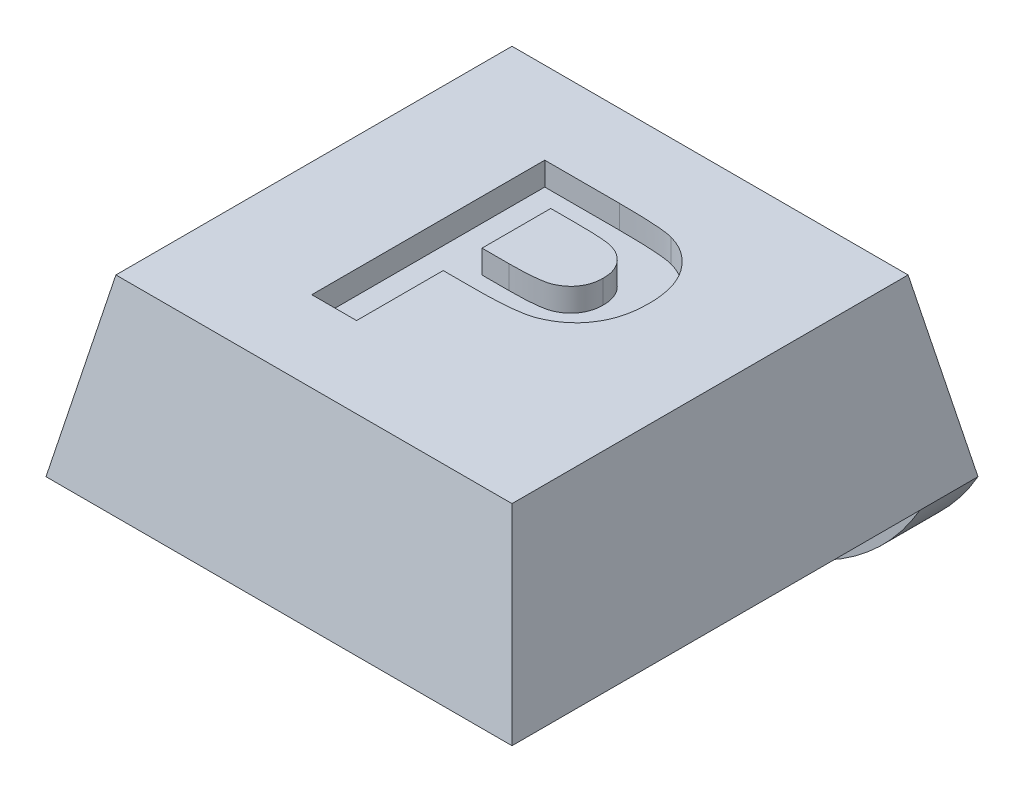
ISO-10303-21;
HEADER;
FILE_DESCRIPTION(('STEP AP214'),'2;1');
FILE_NAME('part.step','',(''),(''),'','','');
FILE_SCHEMA(('AUTOMOTIVE_DESIGN { 1 0 10303 214 1 1 1 1 }'));
ENDSEC;
DATA;
#1=APPLICATION_CONTEXT('core data for automotive mechanical design processes');
#2=APPLICATION_PROTOCOL_DEFINITION('international standard','automotive_design',2000,#1);
#3=PRODUCT_CONTEXT('',#1,'mechanical');
#4=PRODUCT('Part','Part','',(#3));
#5=PRODUCT_RELATED_PRODUCT_CATEGORY('part','',(#4));
#6=PRODUCT_DEFINITION_FORMATION('','',#4);
#7=PRODUCT_DEFINITION_CONTEXT('part definition',#1,'design');
#8=PRODUCT_DEFINITION('design','',#6,#7);
#9=PRODUCT_DEFINITION_SHAPE('','',#8);
#10=(LENGTH_UNIT() NAMED_UNIT(*) SI_UNIT(.MILLI.,.METRE.));
#11=(NAMED_UNIT(*) PLANE_ANGLE_UNIT() SI_UNIT($,.RADIAN.));
#12=(NAMED_UNIT(*) SI_UNIT($,.STERADIAN.) SOLID_ANGLE_UNIT());
#13=UNCERTAINTY_MEASURE_WITH_UNIT(LENGTH_MEASURE(1.E-05),#10,'distance_accuracy_value','');
#14=(GEOMETRIC_REPRESENTATION_CONTEXT(3) GLOBAL_UNCERTAINTY_ASSIGNED_CONTEXT((#13)) GLOBAL_UNIT_ASSIGNED_CONTEXT((#10,
#11,#12)) REPRESENTATION_CONTEXT('',''));
#15=CARTESIAN_POINT('',(0.,0.,0.));
#16=DIRECTION('',(0.,0.,1.));
#17=DIRECTION('',(1.,0.,0.));
#18=AXIS2_PLACEMENT_3D('',#15,#16,#17);
#19=CARTESIAN_POINT('',(0.,3.,0.));
#20=DIRECTION('',(0.,-1.,0.));
#21=DIRECTION('',(0.,0.,-1.));
#22=AXIS2_PLACEMENT_3D('',#19,#20,#21);
#23=PLANE('',#22);
#24=DIRECTION('',(-1.,0.,0.));
#25=VECTOR('',#24,1.);
#26=CARTESIAN_POINT('',(11.,3.,-0.6));
#27=LINE('',#26,#25);
#28=CARTESIAN_POINT('',(7.4,3.,-0.6));
#29=VERTEX_POINT('',#28);
#30=CARTESIAN_POINT('',(0.6,3.,-0.6));
#31=VERTEX_POINT('',#30);
#32=EDGE_CURVE('E409',#29,#31,#27,.T.);
#33=ORIENTED_EDGE('',*,*,#32,.F.);
#34=DIRECTION('',(0.,0.,1.));
#35=VECTOR('',#34,1.);
#36=CARTESIAN_POINT('',(7.4,3.,-8.));
#37=LINE('',#36,#35);
#38=CARTESIAN_POINT('',(7.4,3.,-7.4));
#39=VERTEX_POINT('',#38);
#40=EDGE_CURVE('E422',#39,#29,#37,.T.);
#41=ORIENTED_EDGE('',*,*,#40,.F.);
#42=DIRECTION('',(-1.,0.,0.));
#43=VECTOR('',#42,1.);
#44=CARTESIAN_POINT('',(11.,3.,-7.4));
#45=LINE('',#44,#43);
#46=CARTESIAN_POINT('',(0.599999999999999,3.,-7.4));
#47=VERTEX_POINT('',#46);
#48=EDGE_CURVE('E405',#39,#47,#45,.T.);
#49=ORIENTED_EDGE('',*,*,#48,.T.);
#50=DIRECTION('',(0.,0.,1.));
#51=VECTOR('',#50,1.);
#52=CARTESIAN_POINT('',(0.6,3.,-8.));
#53=LINE('',#52,#51);
#54=EDGE_CURVE('E425',#47,#31,#53,.T.);
#55=ORIENTED_EDGE('',*,*,#54,.T.);
#56=EDGE_LOOP('',(#33,#41,#49,#55));
#57=FACE_BOUND('',#56,.T.);
#58=DIRECTION('',(-1.,0.,0.));
#59=VECTOR('',#58,1.);
#60=CARTESIAN_POINT('',(3.34429936740227,3.,-1.98743460523464));
#61=LINE('',#60,#59);
#62=CARTESIAN_POINT('',(3.34429936740227,3.,-1.98743460523464));
#63=VERTEX_POINT('',#62);
#64=CARTESIAN_POINT('',(2.57506859817151,3.,-1.98743460523464));
#65=VERTEX_POINT('',#64);
#66=EDGE_CURVE('E58',#63,#65,#61,.T.);
#67=ORIENTED_EDGE('',*,*,#66,.T.);
#68=DIRECTION('',(0.,0.,-1.));
#69=VECTOR('',#68,1.);
#70=CARTESIAN_POINT('',(2.57506859817151,3.,-1.98743460523464));
#71=LINE('',#70,#69);
#72=CARTESIAN_POINT('',(2.57506859817151,3.,-5.98743460523464));
#73=VERTEX_POINT('',#72);
#74=EDGE_CURVE('E305',#65,#73,#71,.T.);
#75=ORIENTED_EDGE('',*,*,#74,.T.);
#76=DIRECTION('',(1.,0.,0.));
#77=VECTOR('',#76,1.);
#78=CARTESIAN_POINT('',(2.57506859817151,3.,-5.98743460523464));
#79=LINE('',#78,#77);
#80=CARTESIAN_POINT('',(3.85471603406894,3.,-5.98743460523464));
#81=VERTEX_POINT('',#80);
#82=EDGE_CURVE('E309',#73,#81,#79,.T.);
#83=ORIENTED_EDGE('',*,*,#82,.T.);
#84=CARTESIAN_POINT('',(3.85471603406894,3.,-5.98743460523464));
#85=CARTESIAN_POINT('',(3.91267733034139,3.,-5.9873713087582));
#86=CARTESIAN_POINT('',(4.02353519994447,3.,-5.98725024672229));
#87=CARTESIAN_POINT('',(4.18166724534791,3.,-5.98388663622853));
#88=CARTESIAN_POINT('',(4.32404146149453,3.,-5.97912507491109));
#89=CARTESIAN_POINT('',(4.45044654215817,3.,-5.97319475177512));
#90=CARTESIAN_POINT('',(4.56132727362535,3.,-5.96434557068972));
#91=CARTESIAN_POINT('',(4.65618625742277,3.,-5.95409835213502));
#92=CARTESIAN_POINT('',(4.73562081436113,3.,-5.94307506424868));
#93=CARTESIAN_POINT('',(4.78239747180477,3.,-5.93166743556724));
#94=CARTESIAN_POINT('',(4.80343398278689,3.,-5.9265371693372));
#95=B_SPLINE_CURVE_WITH_KNOTS('',3,(#84,#85,#86,#87,#88,#89,#90,#91,#92,#93,#94),.UNSPECIFIED.,
.F.,.F.,(4,1,1,1,1,1,1,1,4),(0.,0.182560685864353,0.34916901466577,0.498161909879465,
0.631255146517795,0.747720654497027,0.848429126955915,0.931835182126824,1.),.UNSPECIFIED.);
#96=CARTESIAN_POINT('',(4.80343398278689,3.,-5.9265371693372));
#97=VERTEX_POINT('',#96);
#98=EDGE_CURVE('E313',#81,#97,#95,.T.);
#99=ORIENTED_EDGE('',*,*,#98,.T.);
#100=CARTESIAN_POINT('',(4.80343398278689,3.,-5.9265371693372));
#101=CARTESIAN_POINT('',(4.83140742679813,3.,-5.91856086246213));
#102=CARTESIAN_POINT('',(4.88692815940315,3.,-5.90272976204388));
#103=CARTESIAN_POINT('',(4.96647205579809,3.,-5.86898037066802));
#104=CARTESIAN_POINT('',(5.04313977614627,3.,-5.82986662655277));
#105=CARTESIAN_POINT('',(5.1159680726597,3.,-5.78325011363242));
#106=CARTESIAN_POINT('',(5.18520451156456,3.,-5.72995843956961));
#107=CARTESIAN_POINT('',(5.25105489528574,3.,-5.67042620487807));
#108=CARTESIAN_POINT('',(5.31387039447106,3.,-5.60438466868591));
#109=CARTESIAN_POINT('',(5.37278203743094,3.,-5.53196429206569));
#110=CARTESIAN_POINT('',(5.42673817216305,3.,-5.45353025614073));
#111=CARTESIAN_POINT('',(5.47336982918837,3.,-5.36896659796339));
#112=CARTESIAN_POINT('',(5.51243740764187,3.,-5.27864087459389));
#113=CARTESIAN_POINT('',(5.54572233519394,3.,-5.18323187257924));
#114=CARTESIAN_POINT('',(5.57028011348382,3.,-5.08171665273774));
#115=CARTESIAN_POINT('',(5.5874660935616,3.,-4.9748005543834));
#116=CARTESIAN_POINT('',(5.59942968008696,3.,-4.86243681469462));
#117=CARTESIAN_POINT('',(5.60027673902449,3.,-4.78554423542379));
#118=CARTESIAN_POINT('',(5.60070962381253,3.,-4.74624870779874));
#119=B_SPLINE_CURVE_WITH_KNOTS('',3,(#100,#101,#102,#103,#104,#105,#106,#107,#108,#109,#110,
#111,#112,#113,#114,#115,#116,#117,#118),.UNSPECIFIED.,.F.,.F.,(4,1,1,1,1,1,1,1,1,1,1,1,1,1,1,1,
4),(0.,0.0566966089636379,0.112529485629922,0.168226041849801,0.224453827384143,
0.280939346530923,0.338491443016693,0.397460189057406,0.458574525663164,0.520430686158554,
0.582933063936771,0.646631562091252,0.712213800813203,0.779824213865235,0.850065838275486,
0.923376975387564,1.),.UNSPECIFIED.);
#120=CARTESIAN_POINT('',(5.60070962381253,3.,-4.74624870779874));
#121=VERTEX_POINT('',#120);
#122=EDGE_CURVE('E319',#97,#121,#119,.T.);
#123=ORIENTED_EDGE('',*,*,#122,.T.);
#124=CARTESIAN_POINT('',(5.60070962381253,3.,-4.74624870779874));
#125=CARTESIAN_POINT('',(5.59947503862994,3.,-4.68657398155943));
#126=CARTESIAN_POINT('',(5.59709839436345,3.,-4.57169685686097));
#127=CARTESIAN_POINT('',(5.57050796206823,3.,-4.40700657503786));
#128=CARTESIAN_POINT('',(5.52995101147501,3.,-4.25657261940447));
#129=CARTESIAN_POINT('',(5.47067409780915,3.,-4.12184398117083));
#130=CARTESIAN_POINT('',(5.39840322602142,3.,-4.00229196260293));
#131=CARTESIAN_POINT('',(5.31879537281209,3.,-3.89451638248199));
#132=CARTESIAN_POINT('',(5.22789490332984,3.,-3.80176570624637));
#133=CARTESIAN_POINT('',(5.12968496466409,3.,-3.72254310782915));
#134=CARTESIAN_POINT('',(5.02589500902128,3.,-3.65771062011773));
#135=CARTESIAN_POINT('',(4.92191717230211,3.,-3.60244184482264));
#136=CARTESIAN_POINT('',(4.81634842566949,3.,-3.55994944441406));
#137=CARTESIAN_POINT('',(4.74437188927359,3.,-3.54143516382901));
#138=CARTESIAN_POINT('',(4.70888270073561,3.,-3.53230640010644));
#139=B_SPLINE_CURVE_WITH_KNOTS('',3,(#124,#125,#126,#127,#128,#129,#130,#131,#132,#133,#134,
#135,#136,#137,#138),.UNSPECIFIED.,.F.,.F.,(4,1,1,1,1,1,1,1,1,1,1,1,4),(0.,0.109365519513396,
0.210534630229698,0.305156984724237,0.394451765400026,0.479483538783233,0.561008944761298,
0.639657023389005,0.717014175655741,0.791903899167706,0.863782700517929,0.932835870333303,1.),.UNSPECIFIED.);
#140=CARTESIAN_POINT('',(4.70888270073561,3.,-3.53230640010644));
#141=VERTEX_POINT('',#140);
#142=EDGE_CURVE('E328',#121,#141,#139,.T.);
#143=ORIENTED_EDGE('',*,*,#142,.T.);
#144=CARTESIAN_POINT('',(4.70888270073561,3.,-3.53230640010644));
#145=CARTESIAN_POINT('',(4.68355225848501,3.,-3.52748795469995));
#146=CARTESIAN_POINT('',(4.63015870850773,3.,-3.5173312466931));
#147=CARTESIAN_POINT('',(4.54547973233544,3.,-3.50720685738947));
#148=CARTESIAN_POINT('',(4.45292102209927,3.,-3.49600026224677));
#149=CARTESIAN_POINT('',(4.35210187758116,3.,-3.48869069124995));
#150=CARTESIAN_POINT('',(4.24314426366966,3.,-3.48184558447589));
#151=CARTESIAN_POINT('',(4.12609048899226,3.,-3.47861378357699));
#152=CARTESIAN_POINT('',(4.00110783592378,3.,-3.47472011976981));
#153=CARTESIAN_POINT('',(3.91508313964537,3.,-3.47465015551672));
#154=CARTESIAN_POINT('',(3.87074167509458,3.,-3.47461409241413));
#155=B_SPLINE_CURVE_WITH_KNOTS('',3,(#144,#145,#146,#147,#148,#149,#150,#151,#152,#153,#154),
.UNSPECIFIED.,.F.,.F.,(4,1,1,1,1,1,1,1,4),(0.,0.0919192432606345,0.193754797502381,
0.303983189193223,0.424368181524798,0.554124139817009,0.693262123791844,0.841891837429478,1.),.UNSPECIFIED.);
#156=CARTESIAN_POINT('',(3.87074167509458,3.,-3.47461409241413));
#157=VERTEX_POINT('',#156);
#158=EDGE_CURVE('E337',#141,#157,#155,.T.);
#159=ORIENTED_EDGE('',*,*,#158,.T.);
#160=DIRECTION('',(-1.,0.,0.));
#161=VECTOR('',#160,1.);
#162=CARTESIAN_POINT('',(3.87074167509458,3.,-3.47461409241413));
#163=LINE('',#162,#161);
#164=CARTESIAN_POINT('',(3.34429936740227,3.,-3.47461409241413));
#165=VERTEX_POINT('',#164);
#166=EDGE_CURVE('E346',#157,#165,#163,.T.);
#167=ORIENTED_EDGE('',*,*,#166,.T.);
#168=DIRECTION('',(0.,0.,1.));
#169=VECTOR('',#168,1.);
#170=CARTESIAN_POINT('',(3.34429936740227,3.,-3.47461409241413));
#171=LINE('',#170,#169);
#172=EDGE_CURVE('E353',#165,#63,#171,.T.);
#173=ORIENTED_EDGE('',*,*,#172,.T.);
#174=EDGE_LOOP('',(#67,#75,#83,#99,#123,#143,#159,#167,#173));
#175=FACE_BOUND('',#174,.T.);
#176=ADVANCED_FACE('F42',(#57,#175),#23,.F.);
#177=CARTESIAN_POINT('',(8.,0.,-8.));
#178=DIRECTION('',(-0.98058067569092,-0.196116135138184,0.));
#179=DIRECTION('',(0.196116135138184,-0.98058067569092,0.));
#180=AXIS2_PLACEMENT_3D('',#177,#178,#179);
#181=PLANE('',#180);
#182=DIRECTION('',(-0.192450089729875,0.962250448649376,-0.192450089729875));
#183=VECTOR('',#182,1.);
#184=CARTESIAN_POINT('',(7.7037037037037,1.48148148148148,-0.296296296296296));
#185=LINE('',#184,#183);
#186=CARTESIAN_POINT('',(8.,0.,0.));
#187=VERTEX_POINT('',#186);
#188=EDGE_CURVE('E419',#187,#29,#185,.T.);
#189=ORIENTED_EDGE('',*,*,#188,.F.);
#190=DIRECTION('',(0.,0.,-1.));
#191=VECTOR('',#190,1.);
#192=CARTESIAN_POINT('',(8.,0.,0.));
#193=LINE('',#192,#191);
#194=CARTESIAN_POINT('',(8.,0.,-7.));
#195=VERTEX_POINT('',#194);
#196=EDGE_CURVE('E438',#187,#195,#193,.T.);
#197=ORIENTED_EDGE('',*,*,#196,.T.);
#198=DIRECTION('',(0.,0.,1.));
#199=VECTOR('',#198,1.);
#200=CARTESIAN_POINT('',(8.,0.,-8.));
#201=LINE('',#200,#199);
#202=CARTESIAN_POINT('',(8.,0.,-8.));
#203=VERTEX_POINT('',#202);
#204=EDGE_CURVE('E384',#203,#195,#201,.T.);
#205=ORIENTED_EDGE('',*,*,#204,.F.);
#206=DIRECTION('',(0.192450089729875,-0.962250448649376,-0.192450089729875));
#207=VECTOR('',#206,1.);
#208=CARTESIAN_POINT('',(8.,0.,-8.));
#209=LINE('',#208,#207);
#210=EDGE_CURVE('E412',#39,#203,#209,.T.);
#211=ORIENTED_EDGE('',*,*,#210,.F.);
#212=ORIENTED_EDGE('',*,*,#40,.T.);
#213=EDGE_LOOP('',(#189,#197,#205,#211,#212));
#214=FACE_BOUND('',#213,.T.);
#215=ADVANCED_FACE('F511',(#214),#181,.F.);
#216=CARTESIAN_POINT('',(0.,0.,-8.));
#217=DIRECTION('',(0.98058067569092,-0.196116135138184,0.));
#218=DIRECTION('',(0.196116135138184,0.98058067569092,0.));
#219=AXIS2_PLACEMENT_3D('',#216,#217,#218);
#220=PLANE('',#219);
#221=DIRECTION('',(-0.192450089729875,-0.962250448649376,0.192450089729875));
#222=VECTOR('',#221,1.);
#223=CARTESIAN_POINT('',(0.296296296296296,1.48148148148148,-0.296296296296296));
#224=LINE('',#223,#222);
#225=CARTESIAN_POINT('',(0.,0.,0.));
#226=VERTEX_POINT('',#225);
#227=EDGE_CURVE('E466',#31,#226,#224,.T.);
#228=ORIENTED_EDGE('',*,*,#227,.F.);
#229=ORIENTED_EDGE('',*,*,#54,.F.);
#230=DIRECTION('',(0.192450089729875,0.962250448649376,0.192450089729875));
#231=VECTOR('',#230,1.);
#232=CARTESIAN_POINT('',(0.,0.,-8.));
#233=LINE('',#232,#231);
#234=CARTESIAN_POINT('',(0.,0.,-8.));
#235=VERTEX_POINT('',#234);
#236=EDGE_CURVE('E437',#235,#47,#233,.T.);
#237=ORIENTED_EDGE('',*,*,#236,.F.);
#238=DIRECTION('',(0.,0.,1.));
#239=VECTOR('',#238,1.);
#240=CARTESIAN_POINT('',(0.,0.,0.));
#241=LINE('',#240,#239);
#242=CARTESIAN_POINT('',(0.,0.,-7.));
#243=VERTEX_POINT('',#242);
#244=EDGE_CURVE('E442',#235,#243,#241,.T.);
#245=ORIENTED_EDGE('',*,*,#244,.T.);
#246=EDGE_CURVE('E429',#243,#226,#241,.T.);
#247=ORIENTED_EDGE('',*,*,#246,.T.);
#248=EDGE_LOOP('',(#228,#229,#237,#245,#247));
#249=FACE_BOUND('',#248,.T.);
#250=ADVANCED_FACE('F491',(#249),#220,.F.);
#251=CARTESIAN_POINT('',(0.,0.,0.));
#252=DIRECTION('',(0.,-1.,0.));
#253=DIRECTION('',(0.,0.,-1.));
#254=AXIS2_PLACEMENT_3D('',#251,#252,#253);
#255=PLANE('',#254);
#256=DIRECTION('',(-1.,0.,0.));
#257=VECTOR('',#256,1.);
#258=CARTESIAN_POINT('',(0.,0.,-7.));
#259=LINE('',#258,#257);
#260=EDGE_CURVE('E390',#195,#243,#259,.T.);
#261=ORIENTED_EDGE('',*,*,#260,.F.);
#262=ORIENTED_EDGE('',*,*,#196,.F.);
#263=DIRECTION('',(1.,0.,0.));
#264=VECTOR('',#263,1.);
#265=CARTESIAN_POINT('',(0.,0.,0.));
#266=LINE('',#265,#264);
#267=EDGE_CURVE('E439',#226,#187,#266,.T.);
#268=ORIENTED_EDGE('',*,*,#267,.F.);
#269=ORIENTED_EDGE('',*,*,#246,.F.);
#270=EDGE_LOOP('',(#261,#262,#268,#269));
#271=FACE_BOUND('',#270,.T.);
#272=CARTESIAN_POINT('',(4.,0.,-3.75));
#273=DIRECTION('',(0.,-1.,0.));
#274=DIRECTION('',(0.,0.,-1.));
#275=AXIS2_PLACEMENT_3D('',#272,#273,#274);
#276=CIRCLE('',#275,1.8);
#277=CARTESIAN_POINT('',(4.,0.,-5.55));
#278=VERTEX_POINT('',#277);
#279=EDGE_CURVE('E394',#278,#278,#276,.T.);
#280=ORIENTED_EDGE('',*,*,#279,.F.);
#281=EDGE_LOOP('',(#280));
#282=FACE_BOUND('',#281,.T.);
#283=ADVANCED_FACE('F506',(#271,#282),#255,.T.);
#284=CARTESIAN_POINT('',(11.,3.,-7.4));
#285=DIRECTION('',(0.,0.196116135138184,-0.98058067569092));
#286=DIRECTION('',(0.,0.98058067569092,0.196116135138184));
#287=AXIS2_PLACEMENT_3D('',#284,#285,#286);
#288=PLANE('',#287);
#289=ORIENTED_EDGE('',*,*,#210,.T.);
#290=DIRECTION('',(-1.,0.,0.));
#291=VECTOR('',#290,1.);
#292=CARTESIAN_POINT('',(0.,0.,-8.));
#293=LINE('',#292,#291);
#294=EDGE_CURVE('E433',#203,#235,#293,.T.);
#295=ORIENTED_EDGE('',*,*,#294,.T.);
#296=ORIENTED_EDGE('',*,*,#236,.T.);
#297=ORIENTED_EDGE('',*,*,#48,.F.);
#298=EDGE_LOOP('',(#289,#295,#296,#297));
#299=FACE_BOUND('',#298,.T.);
#300=ADVANCED_FACE('F486',(#299),#288,.T.);
#301=CARTESIAN_POINT('',(11.,0.,0.));
#302=DIRECTION('',(0.,0.196116135138184,0.98058067569092));
#303=DIRECTION('',(0.,-0.98058067569092,0.196116135138184));
#304=AXIS2_PLACEMENT_3D('',#301,#302,#303);
#305=PLANE('',#304);
#306=ORIENTED_EDGE('',*,*,#188,.T.);
#307=ORIENTED_EDGE('',*,*,#32,.T.);
#308=ORIENTED_EDGE('',*,*,#227,.T.);
#309=ORIENTED_EDGE('',*,*,#267,.T.);
#310=EDGE_LOOP('',(#306,#307,#308,#309));
#311=FACE_BOUND('',#310,.T.);
#312=ADVANCED_FACE('F515',(#311),#305,.T.);
#313=CARTESIAN_POINT('',(4.,0.8,-3.75));
#314=DIRECTION('',(0.,-1.,0.));
#315=DIRECTION('',(0.,0.,-1.));
#316=AXIS2_PLACEMENT_3D('',#313,#314,#315);
#317=CYLINDRICAL_SURFACE('',#316,1.8);
#318=CARTESIAN_POINT('',(4.,0.8,-3.75));
#319=DIRECTION('',(0.,-1.,0.));
#320=DIRECTION('',(0.,0.,-1.));
#321=AXIS2_PLACEMENT_3D('',#318,#319,#320);
#322=CIRCLE('',#321,1.8);
#323=CARTESIAN_POINT('',(4.,0.8,-5.55));
#324=VERTEX_POINT('',#323);
#325=EDGE_CURVE('E401',#324,#324,#322,.T.);
#326=ORIENTED_EDGE('',*,*,#325,.F.);
#327=EDGE_LOOP('',(#326));
#328=FACE_BOUND('',#327,.T.);
#329=ORIENTED_EDGE('',*,*,#279,.T.);
#330=EDGE_LOOP('',(#329));
#331=FACE_BOUND('',#330,.T.);
#332=ADVANCED_FACE('F578',(#328,#331),#317,.F.);
#333=CARTESIAN_POINT('',(4.,0.8,-3.75));
#334=DIRECTION('',(0.,-1.,0.));
#335=DIRECTION('',(0.,0.,-1.));
#336=AXIS2_PLACEMENT_3D('',#333,#334,#335);
#337=PLANE('',#336);
#338=ORIENTED_EDGE('',*,*,#325,.T.);
#339=EDGE_LOOP('',(#338));
#340=FACE_BOUND('',#339,.T.);
#341=ADVANCED_FACE('F575',(#340),#337,.T.);
#342=CARTESIAN_POINT('',(0.,-2.,-8.));
#343=DIRECTION('',(0.,0.,1.));
#344=DIRECTION('',(1.,0.,0.));
#345=AXIS2_PLACEMENT_3D('',#342,#343,#344);
#346=PLANE('',#345);
#347=ORIENTED_EDGE('',*,*,#294,.F.);
#348=CARTESIAN_POINT('',(4.53589838486225,2.,-8.));
#349=DIRECTION('',(0.,0.,1.));
#350=DIRECTION('',(1.,0.,0.));
#351=AXIS2_PLACEMENT_3D('',#348,#349,#350);
#352=CIRCLE('',#351,4.);
#353=CARTESIAN_POINT('',(4.53589838486225,-2.,-8.));
#354=VERTEX_POINT('',#353);
#355=EDGE_CURVE('E11',#203,#354,#352,.F.);
#356=ORIENTED_EDGE('',*,*,#355,.T.);
#357=DIRECTION('',(1.,0.,0.));
#358=VECTOR('',#357,1.);
#359=CARTESIAN_POINT('',(0.,-2.,-8.));
#360=LINE('',#359,#358);
#361=CARTESIAN_POINT('',(3.46410161513775,-2.,-8.));
#362=VERTEX_POINT('',#361);
#363=EDGE_CURVE('E385',#362,#354,#360,.T.);
#364=ORIENTED_EDGE('',*,*,#363,.F.);
#365=CARTESIAN_POINT('',(3.46410161513775,2.,-8.));
#366=DIRECTION('',(0.,0.,1.));
#367=DIRECTION('',(1.,0.,0.));
#368=AXIS2_PLACEMENT_3D('',#365,#366,#367);
#369=CIRCLE('',#368,4.);
#370=EDGE_CURVE('E51',#362,#235,#369,.F.);
#371=ORIENTED_EDGE('',*,*,#370,.T.);
#372=EDGE_LOOP('',(#347,#356,#364,#371));
#373=FACE_BOUND('',#372,.T.);
#374=ADVANCED_FACE('F479',(#373),#346,.F.);
#375=CARTESIAN_POINT('',(0.,-2.,-7.));
#376=DIRECTION('',(0.,0.,-1.));
#377=DIRECTION('',(-1.,0.,0.));
#378=AXIS2_PLACEMENT_3D('',#375,#376,#377);
#379=PLANE('',#378);
#380=DIRECTION('',(-1.,0.,0.));
#381=VECTOR('',#380,1.);
#382=CARTESIAN_POINT('',(0.,-2.,-7.));
#383=LINE('',#382,#381);
#384=CARTESIAN_POINT('',(4.53589838486225,-2.,-7.));
#385=VERTEX_POINT('',#384);
#386=CARTESIAN_POINT('',(3.46410161513775,-2.,-7.));
#387=VERTEX_POINT('',#386);
#388=EDGE_CURVE('E389',#385,#387,#383,.T.);
#389=ORIENTED_EDGE('',*,*,#388,.F.);
#390=CARTESIAN_POINT('',(4.53589838486225,2.,-7.));
#391=DIRECTION('',(0.,0.,-1.));
#392=DIRECTION('',(-1.,0.,0.));
#393=AXIS2_PLACEMENT_3D('',#390,#391,#392);
#394=CIRCLE('',#393,4.);
#395=EDGE_CURVE('E473',#385,#195,#394,.F.);
#396=ORIENTED_EDGE('',*,*,#395,.T.);
#397=ORIENTED_EDGE('',*,*,#260,.T.);
#398=CARTESIAN_POINT('',(3.46410161513775,2.,-7.));
#399=DIRECTION('',(0.,0.,-1.));
#400=DIRECTION('',(-1.,0.,0.));
#401=AXIS2_PLACEMENT_3D('',#398,#399,#400);
#402=CIRCLE('',#401,4.);
#403=EDGE_CURVE('E470',#243,#387,#402,.F.);
#404=ORIENTED_EDGE('',*,*,#403,.T.);
#405=EDGE_LOOP('',(#389,#396,#397,#404));
#406=FACE_BOUND('',#405,.T.);
#407=ADVANCED_FACE('F497',(#406),#379,.F.);
#408=CARTESIAN_POINT('',(0.,-2.,0.));
#409=DIRECTION('',(0.,1.,0.));
#410=DIRECTION('',(0.,0.,1.));
#411=AXIS2_PLACEMENT_3D('',#408,#409,#410);
#412=PLANE('',#411);
#413=ORIENTED_EDGE('',*,*,#363,.T.);
#414=DIRECTION('',(0.,0.,1.));
#415=VECTOR('',#414,1.);
#416=CARTESIAN_POINT('',(4.53589838486225,-2.,0.));
#417=LINE('',#416,#415);
#418=EDGE_CURVE('E465',#354,#385,#417,.T.);
#419=ORIENTED_EDGE('',*,*,#418,.T.);
#420=ORIENTED_EDGE('',*,*,#388,.T.);
#421=DIRECTION('',(0.,0.,-1.));
#422=VECTOR('',#421,1.);
#423=CARTESIAN_POINT('',(3.46410161513775,-2.,0.));
#424=LINE('',#423,#422);
#425=EDGE_CURVE('E461',#387,#362,#424,.T.);
#426=ORIENTED_EDGE('',*,*,#425,.T.);
#427=EDGE_LOOP('',(#413,#419,#420,#426));
#428=FACE_BOUND('',#427,.T.);
#429=ADVANCED_FACE('F500',(#428),#412,.F.);
#430=CARTESIAN_POINT('',(4.53589838486225,2.,-8.));
#431=DIRECTION('',(0.,0.,1.));
#432=DIRECTION('',(1.,0.,0.));
#433=AXIS2_PLACEMENT_3D('',#430,#431,#432);
#434=CYLINDRICAL_SURFACE('',#433,4.);
#435=ORIENTED_EDGE('',*,*,#355,.F.);
#436=ORIENTED_EDGE('',*,*,#204,.T.);
#437=ORIENTED_EDGE('',*,*,#395,.F.);
#438=ORIENTED_EDGE('',*,*,#418,.F.);
#439=EDGE_LOOP('',(#435,#436,#437,#438));
#440=FACE_BOUND('',#439,.T.);
#441=ADVANCED_FACE('F503',(#440),#434,.T.);
#442=CARTESIAN_POINT('',(3.46410161513775,2.,-8.));
#443=DIRECTION('',(0.,0.,-1.));
#444=DIRECTION('',(-1.,0.,0.));
#445=AXIS2_PLACEMENT_3D('',#442,#443,#444);
#446=CYLINDRICAL_SURFACE('',#445,4.);
#447=ORIENTED_EDGE('',*,*,#403,.F.);
#448=ORIENTED_EDGE('',*,*,#244,.F.);
#449=ORIENTED_EDGE('',*,*,#370,.F.);
#450=ORIENTED_EDGE('',*,*,#425,.F.);
#451=EDGE_LOOP('',(#447,#448,#449,#450));
#452=FACE_BOUND('',#451,.T.);
#453=ADVANCED_FACE('F44',(#452),#446,.T.);
#454=CARTESIAN_POINT('',(3.34429936740227,2.6,-1.98743460523464));
#455=DIRECTION('',(0.,0.,-1.));
#456=DIRECTION('',(-1.,0.,0.));
#457=AXIS2_PLACEMENT_3D('',#454,#455,#456);
#458=PLANE('',#457);
#459=ORIENTED_EDGE('',*,*,#66,.F.);
#460=DIRECTION('',(0.,1.,0.));
#461=VECTOR('',#460,1.);
#462=CARTESIAN_POINT('',(3.34429936740227,2.6,-1.98743460523464));
#463=LINE('',#462,#461);
#464=CARTESIAN_POINT('',(3.34429936740227,2.6,-1.98743460523464));
#465=VERTEX_POINT('',#464);
#466=EDGE_CURVE('E302',#465,#63,#463,.T.);
#467=ORIENTED_EDGE('',*,*,#466,.F.);
#468=DIRECTION('',(-1.,0.,0.));
#469=VECTOR('',#468,1.);
#470=CARTESIAN_POINT('',(3.34429936740227,2.6,-1.98743460523464));
#471=LINE('',#470,#469);
#472=CARTESIAN_POINT('',(2.57506859817151,2.6,-1.98743460523464));
#473=VERTEX_POINT('',#472);
#474=EDGE_CURVE('E357',#465,#473,#471,.T.);
#475=ORIENTED_EDGE('',*,*,#474,.T.);
#476=DIRECTION('',(0.,1.,0.));
#477=VECTOR('',#476,1.);
#478=CARTESIAN_POINT('',(2.57506859817151,2.6,-1.98743460523464));
#479=LINE('',#478,#477);
#480=EDGE_CURVE('E381',#473,#65,#479,.T.);
#481=ORIENTED_EDGE('',*,*,#480,.T.);
#482=EDGE_LOOP('',(#459,#467,#475,#481));
#483=FACE_BOUND('',#482,.T.);
#484=ADVANCED_FACE('F527',(#483),#458,.T.);
#485=CARTESIAN_POINT('',(2.57506859817151,2.6,-1.98743460523464));
#486=DIRECTION('',(1.,0.,0.));
#487=DIRECTION('',(0.,0.,-1.));
#488=AXIS2_PLACEMENT_3D('',#485,#486,#487);
#489=PLANE('',#488);
#490=ORIENTED_EDGE('',*,*,#74,.F.);
#491=ORIENTED_EDGE('',*,*,#480,.F.);
#492=DIRECTION('',(0.,0.,-1.));
#493=VECTOR('',#492,1.);
#494=CARTESIAN_POINT('',(2.57506859817151,2.6,-1.98743460523464));
#495=LINE('',#494,#493);
#496=CARTESIAN_POINT('',(2.57506859817151,2.6,-5.98743460523464));
#497=VERTEX_POINT('',#496);
#498=EDGE_CURVE('E531',#473,#497,#495,.T.);
#499=ORIENTED_EDGE('',*,*,#498,.T.);
#500=DIRECTION('',(0.,1.,0.));
#501=VECTOR('',#500,1.);
#502=CARTESIAN_POINT('',(2.57506859817151,2.6,-5.98743460523464));
#503=LINE('',#502,#501);
#504=EDGE_CURVE('E378',#497,#73,#503,.T.);
#505=ORIENTED_EDGE('',*,*,#504,.T.);
#506=EDGE_LOOP('',(#490,#491,#499,#505));
#507=FACE_BOUND('',#506,.T.);
#508=ADVANCED_FACE('F562',(#507),#489,.T.);
#509=CARTESIAN_POINT('',(2.57506859817151,2.6,-5.98743460523464));
#510=DIRECTION('',(0.,0.,1.));
#511=DIRECTION('',(1.,0.,0.));
#512=AXIS2_PLACEMENT_3D('',#509,#510,#511);
#513=PLANE('',#512);
#514=ORIENTED_EDGE('',*,*,#82,.F.);
#515=ORIENTED_EDGE('',*,*,#504,.F.);
#516=DIRECTION('',(1.,0.,0.));
#517=VECTOR('',#516,1.);
#518=CARTESIAN_POINT('',(2.57506859817151,2.6,-5.98743460523464));
#519=LINE('',#518,#517);
#520=CARTESIAN_POINT('',(3.85471603406894,2.6,-5.98743460523464));
#521=VERTEX_POINT('',#520);
#522=EDGE_CURVE('E535',#497,#521,#519,.T.);
#523=ORIENTED_EDGE('',*,*,#522,.T.);
#524=DIRECTION('',(0.,1.,0.));
#525=VECTOR('',#524,1.);
#526=CARTESIAN_POINT('',(3.85471603406894,2.6,-5.98743460523464));
#527=LINE('',#526,#525);
#528=EDGE_CURVE('E375',#521,#81,#527,.T.);
#529=ORIENTED_EDGE('',*,*,#528,.T.);
#530=EDGE_LOOP('',(#514,#515,#523,#529));
#531=FACE_BOUND('',#530,.T.);
#532=ADVANCED_FACE('F558',(#531),#513,.T.);
#533=CARTESIAN_POINT('',(3.85471603406894,2.6,-5.98743460523464));
#534=CARTESIAN_POINT('',(3.91267733034139,2.6,-5.9873713087582));
#535=CARTESIAN_POINT('',(4.02353519994447,2.6,-5.98725024672229));
#536=CARTESIAN_POINT('',(4.18166724534791,2.6,-5.98388663622853));
#537=CARTESIAN_POINT('',(4.32404146149453,2.6,-5.97912507491109));
#538=CARTESIAN_POINT('',(4.45044654215817,2.6,-5.97319475177512));
#539=CARTESIAN_POINT('',(4.56132727362535,2.6,-5.96434557068972));
#540=CARTESIAN_POINT('',(4.65618625742277,2.6,-5.95409835213502));
#541=CARTESIAN_POINT('',(4.73562081436113,2.6,-5.94307506424868));
#542=CARTESIAN_POINT('',(4.78239747180477,2.6,-5.93166743556724));
#543=CARTESIAN_POINT('',(4.80343398278689,2.6,-5.9265371693372));
#544=B_SPLINE_CURVE_WITH_KNOTS('',3,(#533,#534,#535,#536,#537,#538,#539,#540,#541,#542,#543),
.UNSPECIFIED.,.F.,.F.,(4,1,1,1,1,1,1,1,4),(0.,0.182560685864353,0.34916901466577,
0.498161909879465,0.631255146517795,0.747720654497027,0.848429126955915,0.931835182126824,1.),.UNSPECIFIED.);
#545=DIRECTION('',(0.,1.,0.));
#546=VECTOR('',#545,1.);
#547=SURFACE_OF_LINEAR_EXTRUSION('',#544,#546);
#548=ORIENTED_EDGE('',*,*,#98,.F.);
#549=ORIENTED_EDGE('',*,*,#528,.F.);
#550=CARTESIAN_POINT('',(4.80343398278689,2.6,-5.9265371693372));
#551=VERTEX_POINT('',#550);
#552=EDGE_CURVE('E541',#521,#551,#544,.T.);
#553=ORIENTED_EDGE('',*,*,#552,.T.);
#554=DIRECTION('',(0.,1.,0.));
#555=VECTOR('',#554,1.);
#556=CARTESIAN_POINT('',(4.80343398278689,2.6,-5.9265371693372));
#557=LINE('',#556,#555);
#558=EDGE_CURVE('E372',#551,#97,#557,.T.);
#559=ORIENTED_EDGE('',*,*,#558,.T.);
#560=EDGE_LOOP('',(#548,#549,#553,#559));
#561=FACE_BOUND('',#560,.T.);
#562=ADVANCED_FACE('F554',(#561),#547,.T.);
#563=CARTESIAN_POINT('',(4.80343398278689,2.6,-5.9265371693372));
#564=CARTESIAN_POINT('',(4.83140742679813,2.6,-5.91856086246213));
#565=CARTESIAN_POINT('',(4.88692815940315,2.6,-5.90272976204388));
#566=CARTESIAN_POINT('',(4.96647205579809,2.6,-5.86898037066802));
#567=CARTESIAN_POINT('',(5.04313977614627,2.6,-5.82986662655277));
#568=CARTESIAN_POINT('',(5.1159680726597,2.6,-5.78325011363242));
#569=CARTESIAN_POINT('',(5.18520451156456,2.6,-5.72995843956961));
#570=CARTESIAN_POINT('',(5.25105489528574,2.6,-5.67042620487807));
#571=CARTESIAN_POINT('',(5.31387039447106,2.6,-5.60438466868591));
#572=CARTESIAN_POINT('',(5.37278203743094,2.6,-5.53196429206569));
#573=CARTESIAN_POINT('',(5.42673817216305,2.6,-5.45353025614073));
#574=CARTESIAN_POINT('',(5.47336982918837,2.6,-5.36896659796339));
#575=CARTESIAN_POINT('',(5.51243740764187,2.6,-5.27864087459389));
#576=CARTESIAN_POINT('',(5.54572233519394,2.6,-5.18323187257924));
#577=CARTESIAN_POINT('',(5.57028011348382,2.6,-5.08171665273774));
#578=CARTESIAN_POINT('',(5.5874660935616,2.6,-4.9748005543834));
#579=CARTESIAN_POINT('',(5.59942968008696,2.6,-4.86243681469462));
#580=CARTESIAN_POINT('',(5.60027673902449,2.6,-4.78554423542379));
#581=CARTESIAN_POINT('',(5.60070962381253,2.6,-4.74624870779874));
#582=B_SPLINE_CURVE_WITH_KNOTS('',3,(#563,#564,#565,#566,#567,#568,#569,#570,#571,#572,#573,
#574,#575,#576,#577,#578,#579,#580,#581),.UNSPECIFIED.,.F.,.F.,(4,1,1,1,1,1,1,1,1,1,1,1,1,1,1,1,
4),(0.,0.0566966089636379,0.112529485629922,0.168226041849801,0.224453827384143,
0.280939346530923,0.338491443016693,0.397460189057406,0.458574525663164,0.520430686158554,
0.582933063936771,0.646631562091252,0.712213800813203,0.779824213865235,0.850065838275486,
0.923376975387564,1.),.UNSPECIFIED.);
#583=DIRECTION('',(0.,1.,0.));
#584=VECTOR('',#583,1.);
#585=SURFACE_OF_LINEAR_EXTRUSION('',#582,#584);
#586=ORIENTED_EDGE('',*,*,#122,.F.);
#587=ORIENTED_EDGE('',*,*,#558,.F.);
#588=CARTESIAN_POINT('',(5.60070962381253,2.6,-4.74624870779874));
#589=VERTEX_POINT('',#588);
#590=EDGE_CURVE('E546',#551,#589,#582,.T.);
#591=ORIENTED_EDGE('',*,*,#590,.T.);
#592=DIRECTION('',(0.,1.,0.));
#593=VECTOR('',#592,1.);
#594=CARTESIAN_POINT('',(5.60070962381253,2.6,-4.74624870779874));
#595=LINE('',#594,#593);
#596=EDGE_CURVE('E369',#589,#121,#595,.T.);
#597=ORIENTED_EDGE('',*,*,#596,.T.);
#598=EDGE_LOOP('',(#586,#587,#591,#597));
#599=FACE_BOUND('',#598,.T.);
#600=ADVANCED_FACE('F557',(#599),#585,.T.);
#601=CARTESIAN_POINT('',(5.60070962381253,2.6,-4.74624870779874));
#602=CARTESIAN_POINT('',(5.59947503862994,2.6,-4.68657398155943));
#603=CARTESIAN_POINT('',(5.59709839436345,2.6,-4.57169685686097));
#604=CARTESIAN_POINT('',(5.57050796206823,2.6,-4.40700657503786));
#605=CARTESIAN_POINT('',(5.52995101147501,2.6,-4.25657261940447));
#606=CARTESIAN_POINT('',(5.47067409780915,2.6,-4.12184398117083));
#607=CARTESIAN_POINT('',(5.39840322602142,2.6,-4.00229196260293));
#608=CARTESIAN_POINT('',(5.31879537281209,2.6,-3.89451638248199));
#609=CARTESIAN_POINT('',(5.22789490332984,2.6,-3.80176570624637));
#610=CARTESIAN_POINT('',(5.12968496466409,2.6,-3.72254310782915));
#611=CARTESIAN_POINT('',(5.02589500902128,2.6,-3.65771062011773));
#612=CARTESIAN_POINT('',(4.92191717230211,2.6,-3.60244184482264));
#613=CARTESIAN_POINT('',(4.81634842566949,2.6,-3.55994944441406));
#614=CARTESIAN_POINT('',(4.74437188927359,2.6,-3.54143516382901));
#615=CARTESIAN_POINT('',(4.70888270073561,2.6,-3.53230640010644));
#616=B_SPLINE_CURVE_WITH_KNOTS('',3,(#601,#602,#603,#604,#605,#606,#607,#608,#609,#610,#611,
#612,#613,#614,#615),.UNSPECIFIED.,.F.,.F.,(4,1,1,1,1,1,1,1,1,1,1,1,4),(0.,0.109365519513396,
0.210534630229698,0.305156984724237,0.394451765400026,0.479483538783233,0.561008944761298,
0.639657023389005,0.717014175655741,0.791903899167706,0.863782700517929,0.932835870333303,1.),.UNSPECIFIED.);
#617=DIRECTION('',(0.,1.,0.));
#618=VECTOR('',#617,1.);
#619=SURFACE_OF_LINEAR_EXTRUSION('',#616,#618);
#620=ORIENTED_EDGE('',*,*,#142,.F.);
#621=ORIENTED_EDGE('',*,*,#596,.F.);
#622=CARTESIAN_POINT('',(4.70888270073561,2.6,-3.53230640010644));
#623=VERTEX_POINT('',#622);
#624=EDGE_CURVE('E289',#589,#623,#616,.T.);
#625=ORIENTED_EDGE('',*,*,#624,.T.);
#626=DIRECTION('',(0.,1.,0.));
#627=VECTOR('',#626,1.);
#628=CARTESIAN_POINT('',(4.70888270073561,2.6,-3.53230640010644));
#629=LINE('',#628,#627);
#630=EDGE_CURVE('E366',#623,#141,#629,.T.);
#631=ORIENTED_EDGE('',*,*,#630,.T.);
#632=EDGE_LOOP('',(#620,#621,#625,#631));
#633=FACE_BOUND('',#632,.T.);
#634=ADVANCED_FACE('F278',(#633),#619,.T.);
#635=CARTESIAN_POINT('',(4.70888270073561,2.6,-3.53230640010644));
#636=CARTESIAN_POINT('',(4.68355225848501,2.6,-3.52748795469995));
#637=CARTESIAN_POINT('',(4.63015870850773,2.6,-3.5173312466931));
#638=CARTESIAN_POINT('',(4.54547973233544,2.6,-3.50720685738947));
#639=CARTESIAN_POINT('',(4.45292102209927,2.6,-3.49600026224677));
#640=CARTESIAN_POINT('',(4.35210187758116,2.6,-3.48869069124995));
#641=CARTESIAN_POINT('',(4.24314426366966,2.6,-3.48184558447589));
#642=CARTESIAN_POINT('',(4.12609048899226,2.6,-3.47861378357699));
#643=CARTESIAN_POINT('',(4.00110783592378,2.6,-3.47472011976981));
#644=CARTESIAN_POINT('',(3.91508313964537,2.6,-3.47465015551672));
#645=CARTESIAN_POINT('',(3.87074167509458,2.6,-3.47461409241413));
#646=B_SPLINE_CURVE_WITH_KNOTS('',3,(#635,#636,#637,#638,#639,#640,#641,#642,#643,#644,#645),
.UNSPECIFIED.,.F.,.F.,(4,1,1,1,1,1,1,1,4),(0.,0.0919192432606345,0.193754797502381,
0.303983189193223,0.424368181524798,0.554124139817009,0.693262123791844,0.841891837429478,1.),.UNSPECIFIED.);
#647=DIRECTION('',(0.,1.,0.));
#648=VECTOR('',#647,1.);
#649=SURFACE_OF_LINEAR_EXTRUSION('',#646,#648);
#650=ORIENTED_EDGE('',*,*,#158,.F.);
#651=ORIENTED_EDGE('',*,*,#630,.F.);
#652=CARTESIAN_POINT('',(3.87074167509458,2.6,-3.47461409241413));
#653=VERTEX_POINT('',#652);
#654=EDGE_CURVE('E282',#623,#653,#646,.T.);
#655=ORIENTED_EDGE('',*,*,#654,.T.);
#656=DIRECTION('',(0.,1.,0.));
#657=VECTOR('',#656,1.);
#658=CARTESIAN_POINT('',(3.87074167509458,2.6,-3.47461409241413));
#659=LINE('',#658,#657);
#660=EDGE_CURVE('E363',#653,#157,#659,.T.);
#661=ORIENTED_EDGE('',*,*,#660,.T.);
#662=EDGE_LOOP('',(#650,#651,#655,#661));
#663=FACE_BOUND('',#662,.T.);
#664=ADVANCED_FACE('F273',(#663),#649,.T.);
#665=CARTESIAN_POINT('',(3.87074167509458,2.6,-3.47461409241413));
#666=DIRECTION('',(0.,0.,-1.));
#667=DIRECTION('',(-1.,0.,0.));
#668=AXIS2_PLACEMENT_3D('',#665,#666,#667);
#669=PLANE('',#668);
#670=ORIENTED_EDGE('',*,*,#166,.F.);
#671=ORIENTED_EDGE('',*,*,#660,.F.);
#672=DIRECTION('',(-1.,0.,0.));
#673=VECTOR('',#672,1.);
#674=CARTESIAN_POINT('',(3.87074167509458,2.6,-3.47461409241413));
#675=LINE('',#674,#673);
#676=CARTESIAN_POINT('',(3.34429936740227,2.6,-3.47461409241413));
#677=VERTEX_POINT('',#676);
#678=EDGE_CURVE('E288',#653,#677,#675,.T.);
#679=ORIENTED_EDGE('',*,*,#678,.T.);
#680=DIRECTION('',(0.,1.,0.));
#681=VECTOR('',#680,1.);
#682=CARTESIAN_POINT('',(3.34429936740227,2.6,-3.47461409241413));
#683=LINE('',#682,#681);
#684=EDGE_CURVE('E360',#677,#165,#683,.T.);
#685=ORIENTED_EDGE('',*,*,#684,.T.);
#686=EDGE_LOOP('',(#670,#671,#679,#685));
#687=FACE_BOUND('',#686,.T.);
#688=ADVANCED_FACE('F269',(#687),#669,.T.);
#689=CARTESIAN_POINT('',(3.34429936740227,2.6,-3.47461409241413));
#690=DIRECTION('',(-1.,0.,0.));
#691=DIRECTION('',(0.,0.,1.));
#692=AXIS2_PLACEMENT_3D('',#689,#690,#691);
#693=PLANE('',#692);
#694=ORIENTED_EDGE('',*,*,#172,.F.);
#695=ORIENTED_EDGE('',*,*,#684,.F.);
#696=DIRECTION('',(0.,0.,1.));
#697=VECTOR('',#696,1.);
#698=CARTESIAN_POINT('',(3.34429936740227,2.6,-3.47461409241413));
#699=LINE('',#698,#697);
#700=EDGE_CURVE('E299',#677,#465,#699,.T.);
#701=ORIENTED_EDGE('',*,*,#700,.T.);
#702=ORIENTED_EDGE('',*,*,#466,.T.);
#703=EDGE_LOOP('',(#694,#695,#701,#702));
#704=FACE_BOUND('',#703,.T.);
#705=ADVANCED_FACE('F266',(#704),#693,.T.);
#706=CARTESIAN_POINT('',(4.33082429662095,2.6,-5.9785494007597));
#707=DIRECTION('',(0.,1.,-1.17438537074206E-12));
#708=DIRECTION('',(0.,1.17438537074206E-12,1.));
#709=AXIS2_PLACEMENT_3D('',#706,#707,#708);
#710=PLANE('',#709);
#711=CARTESIAN_POINT('',(4.35872244432535,2.6,-5.2927230667731));
#712=CARTESIAN_POINT('',(4.34458326787378,2.6,-5.29498451276342));
#713=CARTESIAN_POINT('',(4.31319867997969,2.6,-5.3000042217043));
#714=CARTESIAN_POINT('',(4.26103110773503,2.6,-5.30524291226059));
#715=CARTESIAN_POINT('',(4.19931686160207,2.6,-5.3100074960495));
#716=CARTESIAN_POINT('',(4.12798155099989,2.6,-5.3139193616879));
#717=CARTESIAN_POINT('',(4.04730793131379,2.6,-5.31697753481768));
#718=CARTESIAN_POINT('',(3.95702990463326,2.6,-5.31965724871186));
#719=CARTESIAN_POINT('',(3.8573852353525,2.6,-5.31987252813402));
#720=CARTESIAN_POINT('',(3.78767478328279,2.6,-5.32046119894939));
#721=CARTESIAN_POINT('',(3.75135064945356,2.6,-5.32076793856797));
#722=B_SPLINE_CURVE_WITH_KNOTS('',3,(#711,#712,#713,#714,#715,#716,#717,#718,#719,#720,#721),
.UNSPECIFIED.,.F.,.F.,(4,1,1,1,1,1,1,1,4),(0.,0.070575375101205,0.156655450945649,
0.258348344782106,0.375719036051342,0.508809542827525,0.656332342734556,0.82092455858982,1.),.UNSPECIFIED.);
#723=CARTESIAN_POINT('',(4.35872244432535,2.6,-5.2927230667731));
#724=VERTEX_POINT('',#723);
#725=CARTESIAN_POINT('',(3.75135064945356,2.6,-5.32076793856797));
#726=VERTEX_POINT('',#725);
#727=EDGE_CURVE('E206',#724,#726,#722,.T.);
#728=ORIENTED_EDGE('',*,*,#727,.F.);
#729=CARTESIAN_POINT('',(4.83147885458176,2.6,-4.73422947702951));
#730=CARTESIAN_POINT('',(4.83021919525917,2.6,-4.77046917172276));
#731=CARTESIAN_POINT('',(4.82777688192284,2.6,-4.84073316141177));
#732=CARTESIAN_POINT('',(4.80084498349015,2.6,-4.94080080929418));
#733=CARTESIAN_POINT('',(4.75929214171536,2.6,-5.03161341288182));
#734=CARTESIAN_POINT('',(4.69988337513508,2.6,-5.11034538219221));
#735=CARTESIAN_POINT('',(4.62811898335178,2.6,-5.17655249379435));
#736=CARTESIAN_POINT('',(4.54745880205248,2.6,-5.23163916453069));
#737=CARTESIAN_POINT('',(4.45618029655247,2.6,-5.27018923605087));
#738=CARTESIAN_POINT('',(4.39157958066569,2.6,-5.28512596575568));
#739=CARTESIAN_POINT('',(4.35872244432535,2.6,-5.2927230667731));
#740=B_SPLINE_CURVE_WITH_KNOTS('',3,(#729,#730,#731,#732,#733,#734,#735,#736,#737,#738,#739),
.UNSPECIFIED.,.F.,.F.,(4,1,1,1,1,1,1,1,4),(0.,0.135738070383498,0.263178220969094,
0.38608813637491,0.508621177402749,0.630648535451455,0.751346205248274,0.873530013970423,1.),.UNSPECIFIED.);
#741=CARTESIAN_POINT('',(4.83147885458176,2.6,-4.73422947702951));
#742=VERTEX_POINT('',#741);
#743=EDGE_CURVE('E239',#742,#724,#740,.T.);
#744=ORIENTED_EDGE('',*,*,#743,.F.);
#745=CARTESIAN_POINT('',(3.80583782894074,2.6,-4.1412807590808));
#746=CARTESIAN_POINT('',(3.84563833301666,2.6,-4.14133229737373));
#747=CARTESIAN_POINT('',(3.92178170487643,2.6,-4.1414308966125));
#748=CARTESIAN_POINT('',(4.03103055289793,2.6,-4.14497003100338));
#749=CARTESIAN_POINT('',(4.12992271368116,2.6,-4.14929020084006));
#750=CARTESIAN_POINT('',(4.21866481892794,2.6,-4.15644096587021));
#751=CARTESIAN_POINT('',(4.29672119779783,2.6,-4.16586550321607));
#752=CARTESIAN_POINT('',(4.36461457474644,2.6,-4.17713843688798));
#753=CARTESIAN_POINT('',(4.42242407791401,2.6,-4.18923547249441));
#754=CARTESIAN_POINT('',(4.48493718551398,2.6,-4.20928219901429));
#755=CARTESIAN_POINT('',(4.55177619595063,2.6,-4.24171597452864));
#756=CARTESIAN_POINT('',(4.62315240412615,2.6,-4.28833145645211));
#757=CARTESIAN_POINT('',(4.68585631872274,2.6,-4.34406576287965));
#758=CARTESIAN_POINT('',(4.73803428678795,2.6,-4.40952377574158));
#759=CARTESIAN_POINT('',(4.77971293106591,2.6,-4.48225142054718));
#760=CARTESIAN_POINT('',(4.80955487072566,2.6,-4.56150336034432));
#761=CARTESIAN_POINT('',(4.8288237831208,2.6,-4.64596611331615));
#762=CARTESIAN_POINT('',(4.83058382260947,2.6,-4.70447565169294));
#763=CARTESIAN_POINT('',(4.83147885458176,2.6,-4.73422947702951));
#764=B_SPLINE_CURVE_WITH_KNOTS('',3,(#745,#746,#747,#748,#749,#750,#751,#752,#753,#754,#755,
#756,#757,#758,#759,#760,#761,#762,#763),.UNSPECIFIED.,.F.,.F.,(4,1,1,1,1,1,1,1,1,1,1,1,1,1,1,1,
4),(0.,0.0882316223837538,0.168798194619351,0.242310106178018,0.30766373202845,
0.366127388811564,0.416553690011939,0.46022816225266,0.496931612906356,0.561824891954991,
0.624233737849063,0.685457084882651,0.746954721198572,0.809017075528236,0.870491901147409,
0.934141313368153,1.),.UNSPECIFIED.);
#765=CARTESIAN_POINT('',(3.80583782894074,2.6,-4.1412807590808));
#766=VERTEX_POINT('',#765);
#767=EDGE_CURVE('E232',#766,#742,#764,.T.);
#768=ORIENTED_EDGE('',*,*,#767,.F.);
#769=DIRECTION('',(1.,0.,0.));
#770=VECTOR('',#769,1.);
#771=CARTESIAN_POINT('',(3.34429936740227,2.6,-4.1412807590808));
#772=LINE('',#771,#770);
#773=CARTESIAN_POINT('',(3.34429936740227,2.60000000000217,-4.1412807590808));
#774=VERTEX_POINT('',#773);
#775=EDGE_CURVE('E217',#774,#766,#772,.T.);
#776=ORIENTED_EDGE('',*,*,#775,.F.);
#777=DIRECTION('',(0.,0.,1.));
#778=VECTOR('',#777,1.);
#779=CARTESIAN_POINT('',(3.34429936740227,2.6,-5.32076793856797));
#780=LINE('',#779,#778);
#781=CARTESIAN_POINT('',(3.34429936740227,2.6,-5.32076793856797));
#782=VERTEX_POINT('',#781);
#783=EDGE_CURVE('E197',#782,#774,#780,.T.);
#784=ORIENTED_EDGE('',*,*,#783,.F.);
#785=DIRECTION('',(-1.,0.,0.));
#786=VECTOR('',#785,1.);
#787=CARTESIAN_POINT('',(3.75135064945356,2.6,-5.32076793856797));
#788=LINE('',#787,#786);
#789=EDGE_CURVE('E213',#726,#782,#788,.T.);
#790=ORIENTED_EDGE('',*,*,#789,.F.);
#791=EDGE_LOOP('',(#728,#744,#768,#776,#784,#790));
#792=FACE_BOUND('',#791,.T.);
#793=ORIENTED_EDGE('',*,*,#474,.F.);
#794=ORIENTED_EDGE('',*,*,#700,.F.);
#795=ORIENTED_EDGE('',*,*,#678,.F.);
#796=ORIENTED_EDGE('',*,*,#654,.F.);
#797=ORIENTED_EDGE('',*,*,#624,.F.);
#798=ORIENTED_EDGE('',*,*,#590,.F.);
#799=ORIENTED_EDGE('',*,*,#552,.F.);
#800=ORIENTED_EDGE('',*,*,#522,.F.);
#801=ORIENTED_EDGE('',*,*,#498,.F.);
#802=EDGE_LOOP('',(#793,#794,#795,#796,#797,#798,#799,#800,#801));
#803=FACE_BOUND('',#802,.T.);
#804=ADVANCED_FACE('F211',(#792,#803),#710,.T.);
#805=CARTESIAN_POINT('',(3.75135064945356,2.6,-5.32076793856797));
#806=DIRECTION('',(0.,0.,-1.));
#807=DIRECTION('',(-1.,0.,0.));
#808=AXIS2_PLACEMENT_3D('',#805,#806,#807);
#809=PLANE('',#808);
#810=DIRECTION('',(-1.,0.,0.));
#811=VECTOR('',#810,1.);
#812=CARTESIAN_POINT('',(3.75135064945356,3.,-5.32076793856797));
#813=LINE('',#812,#811);
#814=CARTESIAN_POINT('',(3.75135064945356,3.,-5.32076793856797));
#815=VERTEX_POINT('',#814);
#816=CARTESIAN_POINT('',(3.34429936740227,3.00000000000078,-5.32076793856797));
#817=VERTEX_POINT('',#816);
#818=EDGE_CURVE('E886',#815,#817,#813,.T.);
#819=ORIENTED_EDGE('',*,*,#818,.F.);
#820=DIRECTION('',(0.,1.,0.));
#821=VECTOR('',#820,1.);
#822=CARTESIAN_POINT('',(3.75135064945356,2.6,-5.32076793856797));
#823=LINE('',#822,#821);
#824=EDGE_CURVE('E221',#726,#815,#823,.T.);
#825=ORIENTED_EDGE('',*,*,#824,.F.);
#826=ORIENTED_EDGE('',*,*,#789,.T.);
#827=DIRECTION('',(0.,1.,0.));
#828=VECTOR('',#827,1.);
#829=CARTESIAN_POINT('',(3.34429936740227,2.6,-5.32076793856797));
#830=LINE('',#829,#828);
#831=EDGE_CURVE('E194',#782,#817,#830,.T.);
#832=ORIENTED_EDGE('',*,*,#831,.T.);
#833=EDGE_LOOP('',(#819,#825,#826,#832));
#834=FACE_BOUND('',#833,.T.);
#835=ADVANCED_FACE('F220',(#834),#809,.T.);
#836=DIRECTION('',(0.,1.,0.));
#837=VECTOR('',#836,1.);
#838=SURFACE_OF_LINEAR_EXTRUSION('',#722,#837);
#839=CARTESIAN_POINT('',(4.35872244432535,3.,-5.2927230667731));
#840=CARTESIAN_POINT('',(4.34458326787378,3.,-5.29498451276342));
#841=CARTESIAN_POINT('',(4.31319867997969,3.,-5.3000042217043));
#842=CARTESIAN_POINT('',(4.26103110773503,3.,-5.30524291226059));
#843=CARTESIAN_POINT('',(4.19931686160207,3.,-5.3100074960495));
#844=CARTESIAN_POINT('',(4.12798155099989,3.,-5.3139193616879));
#845=CARTESIAN_POINT('',(4.04730793131379,3.,-5.31697753481768));
#846=CARTESIAN_POINT('',(3.95702990463326,3.,-5.31965724871186));
#847=CARTESIAN_POINT('',(3.8573852353525,3.,-5.31987252813402));
#848=CARTESIAN_POINT('',(3.78767478328279,3.,-5.32046119894939));
#849=CARTESIAN_POINT('',(3.75135064945356,3.,-5.32076793856797));
#850=B_SPLINE_CURVE_WITH_KNOTS('',3,(#839,#840,#841,#842,#843,#844,#845,#846,#847,#848,#849),
.UNSPECIFIED.,.F.,.F.,(4,1,1,1,1,1,1,1,4),(0.,0.070575375101205,0.156655450945649,
0.258348344782106,0.375719036051342,0.508809542827525,0.656332342734556,0.82092455858982,1.),.UNSPECIFIED.);
#851=CARTESIAN_POINT('',(4.35872244432535,3.,-5.2927230667731));
#852=VERTEX_POINT('',#851);
#853=EDGE_CURVE('E223',#852,#815,#850,.T.);
#854=ORIENTED_EDGE('',*,*,#853,.F.);
#855=DIRECTION('',(0.,1.,0.));
#856=VECTOR('',#855,1.);
#857=CARTESIAN_POINT('',(4.35872244432535,2.6,-5.2927230667731));
#858=LINE('',#857,#856);
#859=EDGE_CURVE('E850',#724,#852,#858,.T.);
#860=ORIENTED_EDGE('',*,*,#859,.F.);
#861=ORIENTED_EDGE('',*,*,#727,.T.);
#862=ORIENTED_EDGE('',*,*,#824,.T.);
#863=EDGE_LOOP('',(#854,#860,#861,#862));
#864=FACE_BOUND('',#863,.T.);
#865=ADVANCED_FACE('F263',(#864),#838,.T.);
#866=DIRECTION('',(0.,1.,0.));
#867=VECTOR('',#866,1.);
#868=SURFACE_OF_LINEAR_EXTRUSION('',#740,#867);
#869=CARTESIAN_POINT('',(4.83147885458176,3.,-4.73422947702951));
#870=CARTESIAN_POINT('',(4.83021919525917,3.,-4.77046917172276));
#871=CARTESIAN_POINT('',(4.82777688192284,3.,-4.84073316141177));
#872=CARTESIAN_POINT('',(4.80084498349015,3.,-4.94080080929418));
#873=CARTESIAN_POINT('',(4.75929214171536,3.,-5.03161341288182));
#874=CARTESIAN_POINT('',(4.69988337513508,3.,-5.11034538219221));
#875=CARTESIAN_POINT('',(4.62811898335178,3.,-5.17655249379435));
#876=CARTESIAN_POINT('',(4.54745880205248,3.,-5.23163916453069));
#877=CARTESIAN_POINT('',(4.45618029655247,3.,-5.27018923605087));
#878=CARTESIAN_POINT('',(4.39157958066569,3.,-5.28512596575568));
#879=CARTESIAN_POINT('',(4.35872244432535,3.,-5.2927230667731));
#880=B_SPLINE_CURVE_WITH_KNOTS('',3,(#869,#870,#871,#872,#873,#874,#875,#876,#877,#878,#879),
.UNSPECIFIED.,.F.,.F.,(4,1,1,1,1,1,1,1,4),(0.,0.135738070383498,0.263178220969094,
0.38608813637491,0.508621177402749,0.630648535451455,0.751346205248274,0.873530013970423,1.),.UNSPECIFIED.);
#881=CARTESIAN_POINT('',(4.83147885458176,3.,-4.73422947702951));
#882=VERTEX_POINT('',#881);
#883=EDGE_CURVE('E227',#882,#852,#880,.T.);
#884=ORIENTED_EDGE('',*,*,#883,.F.);
#885=DIRECTION('',(0.,1.,0.));
#886=VECTOR('',#885,1.);
#887=CARTESIAN_POINT('',(4.83147885458176,2.6,-4.73422947702951));
#888=LINE('',#887,#886);
#889=EDGE_CURVE('E848',#742,#882,#888,.T.);
#890=ORIENTED_EDGE('',*,*,#889,.F.);
#891=ORIENTED_EDGE('',*,*,#743,.T.);
#892=ORIENTED_EDGE('',*,*,#859,.T.);
#893=EDGE_LOOP('',(#884,#890,#891,#892));
#894=FACE_BOUND('',#893,.T.);
#895=ADVANCED_FACE('F253',(#894),#868,.T.);
#896=DIRECTION('',(0.,1.,0.));
#897=VECTOR('',#896,1.);
#898=SURFACE_OF_LINEAR_EXTRUSION('',#764,#897);
#899=CARTESIAN_POINT('',(3.80583782894074,3.,-4.1412807590808));
#900=CARTESIAN_POINT('',(3.84563833301666,3.,-4.14133229737373));
#901=CARTESIAN_POINT('',(3.92178170487643,3.,-4.1414308966125));
#902=CARTESIAN_POINT('',(4.03103055289793,3.,-4.14497003100338));
#903=CARTESIAN_POINT('',(4.12992271368116,3.,-4.14929020084006));
#904=CARTESIAN_POINT('',(4.21866481892794,3.,-4.15644096587021));
#905=CARTESIAN_POINT('',(4.29672119779783,3.,-4.16586550321607));
#906=CARTESIAN_POINT('',(4.36461457474644,3.,-4.17713843688798));
#907=CARTESIAN_POINT('',(4.42242407791401,3.,-4.18923547249441));
#908=CARTESIAN_POINT('',(4.48493718551398,3.,-4.20928219901429));
#909=CARTESIAN_POINT('',(4.55177619595063,3.,-4.24171597452864));
#910=CARTESIAN_POINT('',(4.62315240412615,3.,-4.28833145645211));
#911=CARTESIAN_POINT('',(4.68585631872274,3.,-4.34406576287965));
#912=CARTESIAN_POINT('',(4.73803428678795,3.,-4.40952377574158));
#913=CARTESIAN_POINT('',(4.77971293106591,3.,-4.48225142054718));
#914=CARTESIAN_POINT('',(4.80955487072566,3.,-4.56150336034432));
#915=CARTESIAN_POINT('',(4.8288237831208,3.,-4.64596611331615));
#916=CARTESIAN_POINT('',(4.83058382260947,3.,-4.70447565169294));
#917=CARTESIAN_POINT('',(4.83147885458176,3.,-4.73422947702951));
#918=B_SPLINE_CURVE_WITH_KNOTS('',3,(#899,#900,#901,#902,#903,#904,#905,#906,#907,#908,#909,
#910,#911,#912,#913,#914,#915,#916,#917),.UNSPECIFIED.,.F.,.F.,(4,1,1,1,1,1,1,1,1,1,1,1,1,1,1,1,
4),(0.,0.0882316223837538,0.168798194619351,0.242310106178018,0.30766373202845,
0.366127388811564,0.416553690011939,0.46022816225266,0.496931612906356,0.561824891954991,
0.624233737849063,0.685457084882651,0.746954721198572,0.809017075528236,0.870491901147409,
0.934141313368153,1.),.UNSPECIFIED.);
#919=CARTESIAN_POINT('',(3.80583782894074,3.,-4.1412807590808));
#920=VERTEX_POINT('',#919);
#921=EDGE_CURVE('E853',#920,#882,#918,.T.);
#922=ORIENTED_EDGE('',*,*,#921,.F.);
#923=DIRECTION('',(0.,1.,0.));
#924=VECTOR('',#923,1.);
#925=CARTESIAN_POINT('',(3.80583782894074,2.6,-4.1412807590808));
#926=LINE('',#925,#924);
#927=EDGE_CURVE('E883',#766,#920,#926,.T.);
#928=ORIENTED_EDGE('',*,*,#927,.F.);
#929=ORIENTED_EDGE('',*,*,#767,.T.);
#930=ORIENTED_EDGE('',*,*,#889,.T.);
#931=EDGE_LOOP('',(#922,#928,#929,#930));
#932=FACE_BOUND('',#931,.T.);
#933=ADVANCED_FACE('F248',(#932),#898,.T.);
#934=CARTESIAN_POINT('',(3.34429936740227,2.6,-4.1412807590808));
#935=DIRECTION('',(0.,0.,1.));
#936=DIRECTION('',(1.,0.,0.));
#937=AXIS2_PLACEMENT_3D('',#934,#935,#936);
#938=PLANE('',#937);
#939=DIRECTION('',(1.,0.,0.));
#940=VECTOR('',#939,1.);
#941=CARTESIAN_POINT('',(3.34429936740227,3.,-4.1412807590808));
#942=LINE('',#941,#940);
#943=CARTESIAN_POINT('',(3.34429936740227,3.,-4.1412807590808));
#944=VERTEX_POINT('',#943);
#945=EDGE_CURVE('E66',#944,#920,#942,.T.);
#946=ORIENTED_EDGE('',*,*,#945,.F.);
#947=DIRECTION('',(0.,1.,0.));
#948=VECTOR('',#947,1.);
#949=CARTESIAN_POINT('',(3.34429936740227,2.6,-4.1412807590808));
#950=LINE('',#949,#948);
#951=EDGE_CURVE('E205',#774,#944,#950,.T.);
#952=ORIENTED_EDGE('',*,*,#951,.F.);
#953=ORIENTED_EDGE('',*,*,#775,.T.);
#954=ORIENTED_EDGE('',*,*,#927,.T.);
#955=EDGE_LOOP('',(#946,#952,#953,#954));
#956=FACE_BOUND('',#955,.T.);
#957=ADVANCED_FACE('F252',(#956),#938,.T.);
#958=CARTESIAN_POINT('',(3.34429936740227,2.6,-5.32076793856797));
#959=DIRECTION('',(-1.,0.,0.));
#960=DIRECTION('',(0.,0.,1.));
#961=AXIS2_PLACEMENT_3D('',#958,#959,#960);
#962=PLANE('',#961);
#963=DIRECTION('',(0.,0.,1.));
#964=VECTOR('',#963,1.);
#965=CARTESIAN_POINT('',(3.34429936740227,3.,-5.32076793856797));
#966=LINE('',#965,#964);
#967=EDGE_CURVE('E199',#817,#944,#966,.T.);
#968=ORIENTED_EDGE('',*,*,#967,.F.);
#969=ORIENTED_EDGE('',*,*,#831,.F.);
#970=ORIENTED_EDGE('',*,*,#783,.T.);
#971=ORIENTED_EDGE('',*,*,#951,.T.);
#972=EDGE_LOOP('',(#968,#969,#970,#971));
#973=FACE_BOUND('',#972,.T.);
#974=ADVANCED_FACE('F196',(#973),#962,.T.);
#975=ORIENTED_EDGE('',*,*,#818,.T.);
#976=ORIENTED_EDGE('',*,*,#967,.T.);
#977=ORIENTED_EDGE('',*,*,#945,.T.);
#978=ORIENTED_EDGE('',*,*,#921,.T.);
#979=ORIENTED_EDGE('',*,*,#883,.T.);
#980=ORIENTED_EDGE('',*,*,#853,.T.);
#981=EDGE_LOOP('',(#975,#976,#977,#978,#979,#980));
#982=FACE_BOUND('',#981,.T.);
#983=ADVANCED_FACE('F260',(#982),#23,.F.);
#984=CLOSED_SHELL('',(#176,#215,#250,#283,#300,#312,#332,#341,#374,#407,#429,#441,#453,#484,
#508,#532,#562,#600,#634,#664,#688,#705,#804,#835,#865,#895,#933,#957,#974,#983));
#985=MANIFOLD_SOLID_BREP('B2',#984);
#986=ADVANCED_BREP_SHAPE_REPRESENTATION('',(#18,#985),#14);
#987=SHAPE_DEFINITION_REPRESENTATION(#9,#986);
ENDSEC;
END-ISO-10303-21;
